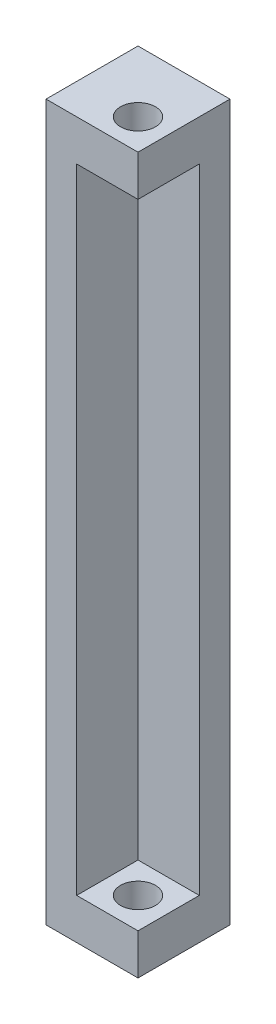
ISO-10303-21;
HEADER;
FILE_DESCRIPTION(('STEP AP214'),'2;1');
FILE_NAME('part.step','',(''),(''),'','','');
FILE_SCHEMA(('AUTOMOTIVE_DESIGN { 1 0 10303 214 1 1 1 1 }'));
ENDSEC;
DATA;
#1=APPLICATION_CONTEXT('core data for automotive mechanical design processes');
#2=APPLICATION_PROTOCOL_DEFINITION('international standard','automotive_design',2000,#1);
#3=PRODUCT_CONTEXT('',#1,'mechanical');
#4=PRODUCT('Part','Part','',(#3));
#5=PRODUCT_RELATED_PRODUCT_CATEGORY('part','',(#4));
#6=PRODUCT_DEFINITION_FORMATION('','',#4);
#7=PRODUCT_DEFINITION_CONTEXT('part definition',#1,'design');
#8=PRODUCT_DEFINITION('design','',#6,#7);
#9=PRODUCT_DEFINITION_SHAPE('','',#8);
#10=(LENGTH_UNIT() NAMED_UNIT(*) SI_UNIT(.MILLI.,.METRE.));
#11=(NAMED_UNIT(*) PLANE_ANGLE_UNIT() SI_UNIT($,.RADIAN.));
#12=(NAMED_UNIT(*) SI_UNIT($,.STERADIAN.) SOLID_ANGLE_UNIT());
#13=UNCERTAINTY_MEASURE_WITH_UNIT(LENGTH_MEASURE(1.E-05),#10,'distance_accuracy_value','');
#14=(GEOMETRIC_REPRESENTATION_CONTEXT(3) GLOBAL_UNCERTAINTY_ASSIGNED_CONTEXT((#13)) GLOBAL_UNIT_ASSIGNED_CONTEXT((#10,
#11,#12)) REPRESENTATION_CONTEXT('',''));
#15=CARTESIAN_POINT('',(0.,0.,0.));
#16=DIRECTION('',(0.,0.,1.));
#17=DIRECTION('',(1.,0.,0.));
#18=AXIS2_PLACEMENT_3D('',#15,#16,#17);
#19=CARTESIAN_POINT('',(2.52817113657981,88.9,0.));
#20=DIRECTION('',(-1.,0.,0.));
#21=DIRECTION('',(0.,0.,1.));
#22=AXIS2_PLACEMENT_3D('',#19,#20,#21);
#23=PLANE('',#22);
#24=DIRECTION('',(0.,0.,-1.));
#25=VECTOR('',#24,1.);
#26=CARTESIAN_POINT('',(2.52817113657981,83.82,11.0566201417858));
#27=LINE('',#26,#25);
#28=CARTESIAN_POINT('',(2.52817113657981,83.82,11.0566201417858));
#29=VERTEX_POINT('',#28);
#30=CARTESIAN_POINT('',(2.52817113657981,83.82,3.43662014178582));
#31=VERTEX_POINT('',#30);
#32=EDGE_CURVE('E120',#29,#31,#27,.T.);
#33=ORIENTED_EDGE('',*,*,#32,.F.);
#34=DIRECTION('',(0.,-1.,0.));
#35=VECTOR('',#34,1.);
#36=CARTESIAN_POINT('',(2.52817113657981,88.9,11.0566201417858));
#37=LINE('',#36,#35);
#38=CARTESIAN_POINT('',(2.52817113657981,5.08,11.0566201417858));
#39=VERTEX_POINT('',#38);
#40=EDGE_CURVE('E58',#29,#39,#37,.T.);
#41=ORIENTED_EDGE('',*,*,#40,.T.);
#42=DIRECTION('',(0.,0.,-1.));
#43=VECTOR('',#42,1.);
#44=CARTESIAN_POINT('',(2.52817113657981,5.08,0.));
#45=LINE('',#44,#43);
#46=CARTESIAN_POINT('',(2.52817113657981,5.08,3.43662014178582));
#47=VERTEX_POINT('',#46);
#48=EDGE_CURVE('E124',#39,#47,#45,.T.);
#49=ORIENTED_EDGE('',*,*,#48,.T.);
#50=DIRECTION('',(0.,-1.,0.));
#51=VECTOR('',#50,1.);
#52=CARTESIAN_POINT('',(2.52817113657981,88.9,3.43662014178582));
#53=LINE('',#52,#51);
#54=EDGE_CURVE('E50',#31,#47,#53,.T.);
#55=ORIENTED_EDGE('',*,*,#54,.F.);
#56=EDGE_LOOP('',(#33,#41,#49,#55));
#57=FACE_BOUND('',#56,.T.);
#58=ADVANCED_FACE('F35',(#57),#23,.F.);
#59=CARTESIAN_POINT('',(0.,88.9,3.43662014178582));
#60=DIRECTION('',(0.,0.,-1.));
#61=DIRECTION('',(-1.,0.,0.));
#62=AXIS2_PLACEMENT_3D('',#59,#60,#61);
#63=PLANE('',#62);
#64=DIRECTION('',(-1.,0.,0.));
#65=VECTOR('',#64,1.);
#66=CARTESIAN_POINT('',(10.1481711365798,83.82,3.43662014178582));
#67=LINE('',#66,#65);
#68=CARTESIAN_POINT('',(10.1481711365798,83.82,3.43662014178582));
#69=VERTEX_POINT('',#68);
#70=EDGE_CURVE('E108',#69,#31,#67,.T.);
#71=ORIENTED_EDGE('',*,*,#70,.T.);
#72=ORIENTED_EDGE('',*,*,#54,.T.);
#73=DIRECTION('',(1.,0.,0.));
#74=VECTOR('',#73,1.);
#75=CARTESIAN_POINT('',(0.,5.08,3.43662014178582));
#76=LINE('',#75,#74);
#77=CARTESIAN_POINT('',(10.1481711365798,5.08,3.43662014178582));
#78=VERTEX_POINT('',#77);
#79=EDGE_CURVE('E126',#47,#78,#76,.T.);
#80=ORIENTED_EDGE('',*,*,#79,.T.);
#81=DIRECTION('',(0.,-1.,0.));
#82=VECTOR('',#81,1.);
#83=CARTESIAN_POINT('',(10.1481711365798,88.9,3.43662014178582));
#84=LINE('',#83,#82);
#85=EDGE_CURVE('E142',#69,#78,#84,.T.);
#86=ORIENTED_EDGE('',*,*,#85,.F.);
#87=EDGE_LOOP('',(#71,#72,#80,#86));
#88=FACE_BOUND('',#87,.T.);
#89=ADVANCED_FACE('F195',(#88),#63,.F.);
#90=CARTESIAN_POINT('',(-1.28182886342019,5.08,-0.373379858214183));
#91=DIRECTION('',(1.,0.,0.));
#92=DIRECTION('',(0.,0.,-1.));
#93=AXIS2_PLACEMENT_3D('',#90,#91,#92);
#94=PLANE('',#93);
#95=DIRECTION('',(0.,0.,1.));
#96=VECTOR('',#95,1.);
#97=CARTESIAN_POINT('',(-1.28182886342019,0.,-0.373379858214183));
#98=LINE('',#97,#96);
#99=CARTESIAN_POINT('',(-1.28182886342019,0.,-0.373379858214183));
#100=VERTEX_POINT('',#99);
#101=CARTESIAN_POINT('',(-1.28182886342019,0.,11.0566201417858));
#102=VERTEX_POINT('',#101);
#103=EDGE_CURVE('E145',#100,#102,#98,.T.);
#104=ORIENTED_EDGE('',*,*,#103,.T.);
#105=DIRECTION('',(0.,-1.,0.));
#106=VECTOR('',#105,1.);
#107=CARTESIAN_POINT('',(-1.28182886342019,5.08,11.0566201417858));
#108=LINE('',#107,#106);
#109=CARTESIAN_POINT('',(-1.28182886342019,88.9,11.0566201417858));
#110=VERTEX_POINT('',#109);
#111=EDGE_CURVE('E11',#110,#102,#108,.T.);
#112=ORIENTED_EDGE('',*,*,#111,.F.);
#113=DIRECTION('',(0.,0.,1.));
#114=VECTOR('',#113,1.);
#115=CARTESIAN_POINT('',(-1.28182886342019,88.9,0.));
#116=LINE('',#115,#114);
#117=CARTESIAN_POINT('',(-1.28182886342019,88.9,-0.373379858214183));
#118=VERTEX_POINT('',#117);
#119=EDGE_CURVE('E135',#118,#110,#116,.T.);
#120=ORIENTED_EDGE('',*,*,#119,.F.);
#121=DIRECTION('',(0.,-1.,0.));
#122=VECTOR('',#121,1.);
#123=CARTESIAN_POINT('',(-1.28182886342019,5.08,-0.373379858214183));
#124=LINE('',#123,#122);
#125=EDGE_CURVE('E152',#118,#100,#124,.T.);
#126=ORIENTED_EDGE('',*,*,#125,.T.);
#127=EDGE_LOOP('',(#104,#112,#120,#126));
#128=FACE_BOUND('',#127,.T.);
#129=ADVANCED_FACE('F37',(#128),#94,.F.);
#130=CARTESIAN_POINT('',(-1.28182886342019,5.08,11.0566201417858));
#131=DIRECTION('',(0.,0.,-1.));
#132=DIRECTION('',(-1.,0.,0.));
#133=AXIS2_PLACEMENT_3D('',#130,#131,#132);
#134=PLANE('',#133);
#135=DIRECTION('',(1.,0.,0.));
#136=VECTOR('',#135,1.);
#137=CARTESIAN_POINT('',(-1.28182886342019,0.,11.0566201417858));
#138=LINE('',#137,#136);
#139=CARTESIAN_POINT('',(10.1481711365798,0.,11.0566201417858));
#140=VERTEX_POINT('',#139);
#141=EDGE_CURVE('E155',#102,#140,#138,.T.);
#142=ORIENTED_EDGE('',*,*,#141,.T.);
#143=DIRECTION('',(0.,-1.,0.));
#144=VECTOR('',#143,1.);
#145=CARTESIAN_POINT('',(10.1481711365798,5.08,11.0566201417858));
#146=LINE('',#145,#144);
#147=CARTESIAN_POINT('',(10.1481711365798,5.08,11.0566201417858));
#148=VERTEX_POINT('',#147);
#149=EDGE_CURVE('E43',#148,#140,#146,.T.);
#150=ORIENTED_EDGE('',*,*,#149,.F.);
#151=DIRECTION('',(1.,0.,0.));
#152=VECTOR('',#151,1.);
#153=CARTESIAN_POINT('',(-1.28182886342019,5.08,11.0566201417858));
#154=LINE('',#153,#152);
#155=EDGE_CURVE('E146',#39,#148,#154,.T.);
#156=ORIENTED_EDGE('',*,*,#155,.F.);
#157=ORIENTED_EDGE('',*,*,#40,.F.);
#158=DIRECTION('',(-1.,0.,0.));
#159=VECTOR('',#158,1.);
#160=CARTESIAN_POINT('',(10.1481711365798,83.82,11.0566201417858));
#161=LINE('',#160,#159);
#162=CARTESIAN_POINT('',(10.1481711365798,83.82,11.0566201417858));
#163=VERTEX_POINT('',#162);
#164=EDGE_CURVE('E107',#163,#29,#161,.T.);
#165=ORIENTED_EDGE('',*,*,#164,.F.);
#166=DIRECTION('',(0.,-1.,0.));
#167=VECTOR('',#166,1.);
#168=CARTESIAN_POINT('',(10.1481711365798,88.9,11.0566201417858));
#169=LINE('',#168,#167);
#170=CARTESIAN_POINT('',(10.1481711365798,88.9,11.0566201417858));
#171=VERTEX_POINT('',#170);
#172=EDGE_CURVE('E111',#171,#163,#169,.T.);
#173=ORIENTED_EDGE('',*,*,#172,.F.);
#174=DIRECTION('',(1.,0.,0.));
#175=VECTOR('',#174,1.);
#176=CARTESIAN_POINT('',(0.,88.9,11.0566201417858));
#177=LINE('',#176,#175);
#178=EDGE_CURVE('E138',#110,#171,#177,.T.);
#179=ORIENTED_EDGE('',*,*,#178,.F.);
#180=ORIENTED_EDGE('',*,*,#111,.T.);
#181=EDGE_LOOP('',(#142,#150,#156,#157,#165,#173,#179,#180));
#182=FACE_BOUND('',#181,.T.);
#183=ADVANCED_FACE('F122',(#182),#134,.F.);
#184=CARTESIAN_POINT('',(10.1481711365798,5.08,-0.373379858214183));
#185=DIRECTION('',(-1.,0.,0.));
#186=DIRECTION('',(0.,0.,1.));
#187=AXIS2_PLACEMENT_3D('',#184,#185,#186);
#188=PLANE('',#187);
#189=DIRECTION('',(0.,0.,-1.));
#190=VECTOR('',#189,1.);
#191=CARTESIAN_POINT('',(10.1481711365798,0.,-0.373379858214183));
#192=LINE('',#191,#190);
#193=CARTESIAN_POINT('',(10.1481711365798,0.,-0.373379858214183));
#194=VERTEX_POINT('',#193);
#195=EDGE_CURVE('E157',#140,#194,#192,.T.);
#196=ORIENTED_EDGE('',*,*,#195,.T.);
#197=DIRECTION('',(0.,-1.,0.));
#198=VECTOR('',#197,1.);
#199=CARTESIAN_POINT('',(10.1481711365798,5.08,-0.373379858214183));
#200=LINE('',#199,#198);
#201=CARTESIAN_POINT('',(10.1481711365798,88.9,-0.373379858214183));
#202=VERTEX_POINT('',#201);
#203=EDGE_CURVE('E162',#202,#194,#200,.T.);
#204=ORIENTED_EDGE('',*,*,#203,.F.);
#205=DIRECTION('',(0.,0.,-1.));
#206=VECTOR('',#205,1.);
#207=CARTESIAN_POINT('',(10.1481711365798,88.9,0.));
#208=LINE('',#207,#206);
#209=EDGE_CURVE('E116',#171,#202,#208,.T.);
#210=ORIENTED_EDGE('',*,*,#209,.F.);
#211=ORIENTED_EDGE('',*,*,#172,.T.);
#212=DIRECTION('',(0.,0.,-1.));
#213=VECTOR('',#212,1.);
#214=CARTESIAN_POINT('',(10.1481711365798,83.82,11.0566201417858));
#215=LINE('',#214,#213);
#216=EDGE_CURVE('E103',#163,#69,#215,.T.);
#217=ORIENTED_EDGE('',*,*,#216,.T.);
#218=ORIENTED_EDGE('',*,*,#85,.T.);
#219=DIRECTION('',(0.,0.,-1.));
#220=VECTOR('',#219,1.);
#221=CARTESIAN_POINT('',(10.1481711365798,5.08,-0.373379858214183));
#222=LINE('',#221,#220);
#223=EDGE_CURVE('E148',#148,#78,#222,.T.);
#224=ORIENTED_EDGE('',*,*,#223,.F.);
#225=ORIENTED_EDGE('',*,*,#149,.T.);
#226=EDGE_LOOP('',(#196,#204,#210,#211,#217,#218,#224,#225));
#227=FACE_BOUND('',#226,.T.);
#228=ADVANCED_FACE('F114',(#227),#188,.F.);
#229=CARTESIAN_POINT('',(-1.28182886342019,5.08,-0.373379858214183));
#230=DIRECTION('',(0.,0.,1.));
#231=DIRECTION('',(1.,0.,0.));
#232=AXIS2_PLACEMENT_3D('',#229,#230,#231);
#233=PLANE('',#232);
#234=DIRECTION('',(-1.,0.,0.));
#235=VECTOR('',#234,1.);
#236=CARTESIAN_POINT('',(-1.28182886342019,0.,-0.373379858214183));
#237=LINE('',#236,#235);
#238=EDGE_CURVE('E149',#194,#100,#237,.T.);
#239=ORIENTED_EDGE('',*,*,#238,.T.);
#240=ORIENTED_EDGE('',*,*,#125,.F.);
#241=DIRECTION('',(-1.,0.,0.));
#242=VECTOR('',#241,1.);
#243=CARTESIAN_POINT('',(0.,88.9,-0.373379858214183));
#244=LINE('',#243,#242);
#245=EDGE_CURVE('E132',#202,#118,#244,.T.);
#246=ORIENTED_EDGE('',*,*,#245,.F.);
#247=ORIENTED_EDGE('',*,*,#203,.T.);
#248=EDGE_LOOP('',(#239,#240,#246,#247));
#249=FACE_BOUND('',#248,.T.);
#250=ADVANCED_FACE('F173',(#249),#233,.F.);
#251=CARTESIAN_POINT('',(0.,5.08,0.));
#252=DIRECTION('',(0.,1.,0.));
#253=DIRECTION('',(0.,0.,1.));
#254=AXIS2_PLACEMENT_3D('',#251,#252,#253);
#255=PLANE('',#254);
#256=CARTESIAN_POINT('',(6.33817113657981,5.08,7.24662014178582));
#257=DIRECTION('',(0.,1.,0.));
#258=DIRECTION('',(0.,0.,1.));
#259=AXIS2_PLACEMENT_3D('',#256,#257,#258);
#260=CIRCLE('',#259,2.1717);
#261=CARTESIAN_POINT('',(6.33817113657981,5.08,9.41832014178582));
#262=VERTEX_POINT('',#261);
#263=EDGE_CURVE('E286',#262,#262,#260,.T.);
#264=ORIENTED_EDGE('',*,*,#263,.F.);
#265=EDGE_LOOP('',(#264));
#266=FACE_BOUND('',#265,.T.);
#267=ORIENTED_EDGE('',*,*,#48,.F.);
#268=ORIENTED_EDGE('',*,*,#155,.T.);
#269=ORIENTED_EDGE('',*,*,#223,.T.);
#270=ORIENTED_EDGE('',*,*,#79,.F.);
#271=EDGE_LOOP('',(#267,#268,#269,#270));
#272=FACE_BOUND('',#271,.T.);
#273=ADVANCED_FACE('F189',(#266,#272),#255,.T.);
#274=CARTESIAN_POINT('',(0.,0.,0.));
#275=DIRECTION('',(0.,1.,0.));
#276=DIRECTION('',(0.,0.,1.));
#277=AXIS2_PLACEMENT_3D('',#274,#275,#276);
#278=PLANE('',#277);
#279=CARTESIAN_POINT('',(6.33817113657981,0.,7.24662014178582));
#280=DIRECTION('',(0.,1.,0.));
#281=DIRECTION('',(0.,0.,1.));
#282=AXIS2_PLACEMENT_3D('',#279,#280,#281);
#283=CIRCLE('',#282,2.1717);
#284=CARTESIAN_POINT('',(6.33817113657981,0.,9.41832014178582));
#285=VERTEX_POINT('',#284);
#286=EDGE_CURVE('E283',#285,#285,#283,.T.);
#287=ORIENTED_EDGE('',*,*,#286,.T.);
#288=EDGE_LOOP('',(#287));
#289=FACE_BOUND('',#288,.T.);
#290=ORIENTED_EDGE('',*,*,#103,.F.);
#291=ORIENTED_EDGE('',*,*,#238,.F.);
#292=ORIENTED_EDGE('',*,*,#195,.F.);
#293=ORIENTED_EDGE('',*,*,#141,.F.);
#294=EDGE_LOOP('',(#290,#291,#292,#293));
#295=FACE_BOUND('',#294,.T.);
#296=ADVANCED_FACE('F171',(#289,#295),#278,.F.);
#297=CARTESIAN_POINT('',(0.,88.9,0.));
#298=DIRECTION('',(0.,1.,0.));
#299=DIRECTION('',(0.,0.,1.));
#300=AXIS2_PLACEMENT_3D('',#297,#298,#299);
#301=PLANE('',#300);
#302=CARTESIAN_POINT('',(6.33817113657981,88.9,7.24662014178582));
#303=DIRECTION('',(0.,1.,0.));
#304=DIRECTION('',(0.,0.,1.));
#305=AXIS2_PLACEMENT_3D('',#302,#303,#304);
#306=CIRCLE('',#305,2.1717);
#307=CARTESIAN_POINT('',(6.33817113657981,88.9,9.41832014178582));
#308=VERTEX_POINT('',#307);
#309=EDGE_CURVE('E288',#308,#308,#306,.T.);
#310=ORIENTED_EDGE('',*,*,#309,.F.);
#311=EDGE_LOOP('',(#310));
#312=FACE_BOUND('',#311,.T.);
#313=ORIENTED_EDGE('',*,*,#178,.T.);
#314=ORIENTED_EDGE('',*,*,#209,.T.);
#315=ORIENTED_EDGE('',*,*,#245,.T.);
#316=ORIENTED_EDGE('',*,*,#119,.T.);
#317=EDGE_LOOP('',(#313,#314,#315,#316));
#318=FACE_BOUND('',#317,.T.);
#319=ADVANCED_FACE('F178',(#312,#318),#301,.T.);
#320=CARTESIAN_POINT('',(10.1481711365798,83.82,11.0566201417858));
#321=DIRECTION('',(0.,1.,0.));
#322=DIRECTION('',(0.,0.,1.));
#323=AXIS2_PLACEMENT_3D('',#320,#321,#322);
#324=PLANE('',#323);
#325=CARTESIAN_POINT('',(6.33817113657981,83.82,7.24662014178582));
#326=DIRECTION('',(0.,1.,0.));
#327=DIRECTION('',(0.,0.,1.));
#328=AXIS2_PLACEMENT_3D('',#325,#326,#327);
#329=CIRCLE('',#328,2.1717);
#330=CARTESIAN_POINT('',(6.33817113657981,83.82,9.41832014178582));
#331=VERTEX_POINT('',#330);
#332=EDGE_CURVE('E291',#331,#331,#329,.T.);
#333=ORIENTED_EDGE('',*,*,#332,.T.);
#334=EDGE_LOOP('',(#333));
#335=FACE_BOUND('',#334,.T.);
#336=ORIENTED_EDGE('',*,*,#32,.T.);
#337=ORIENTED_EDGE('',*,*,#70,.F.);
#338=ORIENTED_EDGE('',*,*,#216,.F.);
#339=ORIENTED_EDGE('',*,*,#164,.T.);
#340=EDGE_LOOP('',(#336,#337,#338,#339));
#341=FACE_BOUND('',#340,.T.);
#342=ADVANCED_FACE('F105',(#335,#341),#324,.F.);
#343=CARTESIAN_POINT('',(6.33817113657981,83.82,7.24662014178582));
#344=DIRECTION('',(0.,1.,0.));
#345=DIRECTION('',(0.,0.,1.));
#346=AXIS2_PLACEMENT_3D('',#343,#344,#345);
#347=CYLINDRICAL_SURFACE('',#346,2.1717);
#348=ORIENTED_EDGE('',*,*,#332,.F.);
#349=EDGE_LOOP('',(#348));
#350=FACE_BOUND('',#349,.T.);
#351=ORIENTED_EDGE('',*,*,#309,.T.);
#352=EDGE_LOOP('',(#351));
#353=FACE_BOUND('',#352,.T.);
#354=ADVANCED_FACE('F186',(#350,#353),#347,.F.);
#355=CARTESIAN_POINT('',(6.33817113657981,0.,7.24662014178582));
#356=DIRECTION('',(0.,1.,0.));
#357=DIRECTION('',(0.,0.,1.));
#358=AXIS2_PLACEMENT_3D('',#355,#356,#357);
#359=CYLINDRICAL_SURFACE('',#358,2.1717);
#360=ORIENTED_EDGE('',*,*,#286,.F.);
#361=EDGE_LOOP('',(#360));
#362=FACE_BOUND('',#361,.T.);
#363=ORIENTED_EDGE('',*,*,#263,.T.);
#364=EDGE_LOOP('',(#363));
#365=FACE_BOUND('',#364,.T.);
#366=ADVANCED_FACE('F252',(#362,#365),#359,.F.);
#367=CLOSED_SHELL('',(#58,#89,#129,#183,#228,#250,#273,#296,#319,#342,#354,#366));
#368=MANIFOLD_SOLID_BREP('B2',#367);
#369=ADVANCED_BREP_SHAPE_REPRESENTATION('',(#18,#368),#14);
#370=SHAPE_DEFINITION_REPRESENTATION(#9,#369);
ENDSEC;
END-ISO-10303-21;
